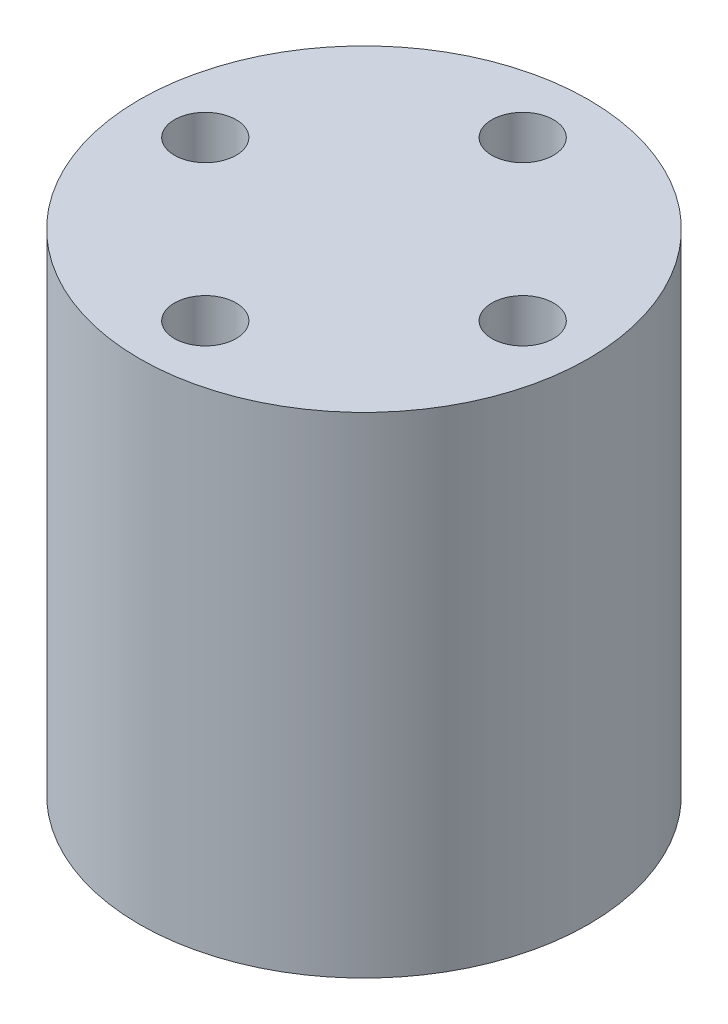
ISO-10303-21;
HEADER;
FILE_DESCRIPTION(('STEP AP214'),'2;1');
FILE_NAME('part.step','',(''),(''),'','','');
FILE_SCHEMA(('AUTOMOTIVE_DESIGN { 1 0 10303 214 1 1 1 1 }'));
ENDSEC;
DATA;
#1=APPLICATION_CONTEXT('core data for automotive mechanical design processes');
#2=APPLICATION_PROTOCOL_DEFINITION('international standard','automotive_design',2000,#1);
#3=PRODUCT_CONTEXT('',#1,'mechanical');
#4=PRODUCT('Part','Part','',(#3));
#5=PRODUCT_RELATED_PRODUCT_CATEGORY('part','',(#4));
#6=PRODUCT_DEFINITION_FORMATION('','',#4);
#7=PRODUCT_DEFINITION_CONTEXT('part definition',#1,'design');
#8=PRODUCT_DEFINITION('design','',#6,#7);
#9=PRODUCT_DEFINITION_SHAPE('','',#8);
#10=(LENGTH_UNIT() NAMED_UNIT(*) SI_UNIT(.MILLI.,.METRE.));
#11=(NAMED_UNIT(*) PLANE_ANGLE_UNIT() SI_UNIT($,.RADIAN.));
#12=(NAMED_UNIT(*) SI_UNIT($,.STERADIAN.) SOLID_ANGLE_UNIT());
#13=UNCERTAINTY_MEASURE_WITH_UNIT(LENGTH_MEASURE(1.E-05),#10,'distance_accuracy_value','');
#14=(GEOMETRIC_REPRESENTATION_CONTEXT(3) GLOBAL_UNCERTAINTY_ASSIGNED_CONTEXT((#13)) GLOBAL_UNIT_ASSIGNED_CONTEXT((#10,
#11,#12)) REPRESENTATION_CONTEXT('',''));
#15=CARTESIAN_POINT('',(0.,0.,0.));
#16=DIRECTION('',(0.,0.,1.));
#17=DIRECTION('',(1.,0.,0.));
#18=AXIS2_PLACEMENT_3D('',#15,#16,#17);
#19=CARTESIAN_POINT('',(-11.3137084989848,34.925,0.));
#20=DIRECTION('',(0.,-1.,0.));
#21=DIRECTION('',(0.,0.,-1.));
#22=AXIS2_PLACEMENT_3D('',#19,#20,#21);
#23=CYLINDRICAL_SURFACE('',#22,2.2);
#24=CARTESIAN_POINT('',(-11.3137084989848,34.925,0.));
#25=DIRECTION('',(0.,1.,0.));
#26=DIRECTION('',(0.,0.,1.));
#27=AXIS2_PLACEMENT_3D('',#24,#25,#26);
#28=CIRCLE('',#27,2.2);
#29=CARTESIAN_POINT('',(-11.3137084989848,34.925,2.2));
#30=VERTEX_POINT('',#29);
#31=EDGE_CURVE('E41',#30,#30,#28,.T.);
#32=ORIENTED_EDGE('',*,*,#31,.T.);
#33=EDGE_LOOP('',(#32));
#34=FACE_BOUND('',#33,.T.);
#35=CARTESIAN_POINT('',(-11.3137084989848,0.,0.));
#36=DIRECTION('',(0.,1.,0.));
#37=DIRECTION('',(0.,0.,1.));
#38=AXIS2_PLACEMENT_3D('',#35,#36,#37);
#39=CIRCLE('',#38,2.2);
#40=CARTESIAN_POINT('',(-11.3137084989848,0.,2.2));
#41=VERTEX_POINT('',#40);
#42=EDGE_CURVE('E58',#41,#41,#39,.T.);
#43=ORIENTED_EDGE('',*,*,#42,.F.);
#44=EDGE_LOOP('',(#43));
#45=FACE_BOUND('',#44,.T.);
#46=ADVANCED_FACE('F33',(#34,#45),#23,.F.);
#47=CARTESIAN_POINT('',(0.,34.925,-11.3137084989848));
#48=DIRECTION('',(0.,-1.,0.));
#49=DIRECTION('',(0.,0.,-1.));
#50=AXIS2_PLACEMENT_3D('',#47,#48,#49);
#51=CYLINDRICAL_SURFACE('',#50,2.2);
#52=CARTESIAN_POINT('',(0.,34.925,-11.3137084989848));
#53=DIRECTION('',(0.,1.,0.));
#54=DIRECTION('',(0.,0.,1.));
#55=AXIS2_PLACEMENT_3D('',#52,#53,#54);
#56=CIRCLE('',#55,2.2);
#57=CARTESIAN_POINT('',(0.,34.925,-9.11370849898476));
#58=VERTEX_POINT('',#57);
#59=EDGE_CURVE('E46',#58,#58,#56,.T.);
#60=ORIENTED_EDGE('',*,*,#59,.T.);
#61=EDGE_LOOP('',(#60));
#62=FACE_BOUND('',#61,.T.);
#63=CARTESIAN_POINT('',(0.,0.,-11.3137084989848));
#64=DIRECTION('',(0.,1.,0.));
#65=DIRECTION('',(0.,0.,1.));
#66=AXIS2_PLACEMENT_3D('',#63,#64,#65);
#67=CIRCLE('',#66,2.2);
#68=CARTESIAN_POINT('',(0.,0.,-9.11370849898476));
#69=VERTEX_POINT('',#68);
#70=EDGE_CURVE('E56',#69,#69,#67,.T.);
#71=ORIENTED_EDGE('',*,*,#70,.F.);
#72=EDGE_LOOP('',(#71));
#73=FACE_BOUND('',#72,.T.);
#74=ADVANCED_FACE('F76',(#62,#73),#51,.F.);
#75=CARTESIAN_POINT('',(11.3137084989848,34.925,0.));
#76=DIRECTION('',(0.,-1.,0.));
#77=DIRECTION('',(0.,0.,-1.));
#78=AXIS2_PLACEMENT_3D('',#75,#76,#77);
#79=CYLINDRICAL_SURFACE('',#78,2.2);
#80=CARTESIAN_POINT('',(11.3137084989848,34.925,0.));
#81=DIRECTION('',(0.,1.,0.));
#82=DIRECTION('',(0.,0.,1.));
#83=AXIS2_PLACEMENT_3D('',#80,#81,#82);
#84=CIRCLE('',#83,2.2);
#85=CARTESIAN_POINT('',(11.3137084989848,34.925,2.2));
#86=VERTEX_POINT('',#85);
#87=EDGE_CURVE('E67',#86,#86,#84,.T.);
#88=ORIENTED_EDGE('',*,*,#87,.T.);
#89=EDGE_LOOP('',(#88));
#90=FACE_BOUND('',#89,.T.);
#91=CARTESIAN_POINT('',(11.3137084989848,0.,0.));
#92=DIRECTION('',(0.,1.,0.));
#93=DIRECTION('',(0.,0.,1.));
#94=AXIS2_PLACEMENT_3D('',#91,#92,#93);
#95=CIRCLE('',#94,2.2);
#96=CARTESIAN_POINT('',(11.3137084989848,0.,2.2));
#97=VERTEX_POINT('',#96);
#98=EDGE_CURVE('E53',#97,#97,#95,.T.);
#99=ORIENTED_EDGE('',*,*,#98,.F.);
#100=EDGE_LOOP('',(#99));
#101=FACE_BOUND('',#100,.T.);
#102=ADVANCED_FACE('F94',(#90,#101),#79,.F.);
#103=CARTESIAN_POINT('',(0.,34.925,11.3137084989848));
#104=DIRECTION('',(0.,-1.,0.));
#105=DIRECTION('',(0.,0.,-1.));
#106=AXIS2_PLACEMENT_3D('',#103,#104,#105);
#107=CYLINDRICAL_SURFACE('',#106,2.2);
#108=CARTESIAN_POINT('',(0.,34.925,11.3137084989848));
#109=DIRECTION('',(0.,1.,0.));
#110=DIRECTION('',(0.,0.,1.));
#111=AXIS2_PLACEMENT_3D('',#108,#109,#110);
#112=CIRCLE('',#111,2.2);
#113=CARTESIAN_POINT('',(0.,34.925,13.5137084989848));
#114=VERTEX_POINT('',#113);
#115=EDGE_CURVE('E63',#114,#114,#112,.T.);
#116=ORIENTED_EDGE('',*,*,#115,.T.);
#117=EDGE_LOOP('',(#116));
#118=FACE_BOUND('',#117,.T.);
#119=CARTESIAN_POINT('',(0.,0.,11.3137084989848));
#120=DIRECTION('',(0.,1.,0.));
#121=DIRECTION('',(0.,0.,1.));
#122=AXIS2_PLACEMENT_3D('',#119,#120,#121);
#123=CIRCLE('',#122,2.2);
#124=CARTESIAN_POINT('',(0.,0.,13.5137084989848));
#125=VERTEX_POINT('',#124);
#126=EDGE_CURVE('E50',#125,#125,#123,.T.);
#127=ORIENTED_EDGE('',*,*,#126,.F.);
#128=EDGE_LOOP('',(#127));
#129=FACE_BOUND('',#128,.T.);
#130=ADVANCED_FACE('F35',(#118,#129),#107,.F.);
#131=CARTESIAN_POINT('',(0.,34.925,0.));
#132=DIRECTION('',(0.,-1.,0.));
#133=DIRECTION('',(0.,0.,-1.));
#134=AXIS2_PLACEMENT_3D('',#131,#132,#133);
#135=CYLINDRICAL_SURFACE('',#134,16.);
#136=CARTESIAN_POINT('',(0.,34.925,0.));
#137=DIRECTION('',(0.,1.,0.));
#138=DIRECTION('',(0.,0.,1.));
#139=AXIS2_PLACEMENT_3D('',#136,#137,#138);
#140=CIRCLE('',#139,16.);
#141=CARTESIAN_POINT('',(0.,34.925,16.));
#142=VERTEX_POINT('',#141);
#143=EDGE_CURVE('E10',#142,#142,#140,.T.);
#144=ORIENTED_EDGE('',*,*,#143,.F.);
#145=EDGE_LOOP('',(#144));
#146=FACE_BOUND('',#145,.T.);
#147=CARTESIAN_POINT('',(0.,0.,0.));
#148=DIRECTION('',(0.,1.,0.));
#149=DIRECTION('',(0.,0.,1.));
#150=AXIS2_PLACEMENT_3D('',#147,#148,#149);
#151=CIRCLE('',#150,16.);
#152=CARTESIAN_POINT('',(0.,0.,16.));
#153=VERTEX_POINT('',#152);
#154=EDGE_CURVE('E37',#153,#153,#151,.T.);
#155=ORIENTED_EDGE('',*,*,#154,.T.);
#156=EDGE_LOOP('',(#155));
#157=FACE_BOUND('',#156,.T.);
#158=ADVANCED_FACE('F83',(#146,#157),#135,.T.);
#159=CARTESIAN_POINT('',(0.,34.925,0.));
#160=DIRECTION('',(0.,1.,0.));
#161=DIRECTION('',(0.,0.,1.));
#162=AXIS2_PLACEMENT_3D('',#159,#160,#161);
#163=PLANE('',#162);
#164=ORIENTED_EDGE('',*,*,#115,.F.);
#165=EDGE_LOOP('',(#164));
#166=FACE_BOUND('',#165,.T.);
#167=ORIENTED_EDGE('',*,*,#87,.F.);
#168=EDGE_LOOP('',(#167));
#169=FACE_BOUND('',#168,.T.);
#170=ORIENTED_EDGE('',*,*,#59,.F.);
#171=EDGE_LOOP('',(#170));
#172=FACE_BOUND('',#171,.T.);
#173=ORIENTED_EDGE('',*,*,#31,.F.);
#174=EDGE_LOOP('',(#173));
#175=FACE_BOUND('',#174,.T.);
#176=ORIENTED_EDGE('',*,*,#143,.T.);
#177=EDGE_LOOP('',(#176));
#178=FACE_BOUND('',#177,.T.);
#179=ADVANCED_FACE('F79',(#166,#169,#172,#175,#178),#163,.T.);
#180=CARTESIAN_POINT('',(0.,0.,0.));
#181=DIRECTION('',(0.,1.,0.));
#182=DIRECTION('',(0.,0.,1.));
#183=AXIS2_PLACEMENT_3D('',#180,#181,#182);
#184=PLANE('',#183);
#185=ORIENTED_EDGE('',*,*,#126,.T.);
#186=EDGE_LOOP('',(#185));
#187=FACE_BOUND('',#186,.T.);
#188=ORIENTED_EDGE('',*,*,#98,.T.);
#189=EDGE_LOOP('',(#188));
#190=FACE_BOUND('',#189,.T.);
#191=ORIENTED_EDGE('',*,*,#70,.T.);
#192=EDGE_LOOP('',(#191));
#193=FACE_BOUND('',#192,.T.);
#194=ORIENTED_EDGE('',*,*,#42,.T.);
#195=EDGE_LOOP('',(#194));
#196=FACE_BOUND('',#195,.T.);
#197=ORIENTED_EDGE('',*,*,#154,.F.);
#198=EDGE_LOOP('',(#197));
#199=FACE_BOUND('',#198,.T.);
#200=ADVANCED_FACE('F82',(#187,#190,#193,#196,#199),#184,.F.);
#201=CLOSED_SHELL('',(#46,#74,#102,#130,#158,#179,#200));
#202=MANIFOLD_SOLID_BREP('B2',#201);
#203=ADVANCED_BREP_SHAPE_REPRESENTATION('',(#18,#202),#14);
#204=SHAPE_DEFINITION_REPRESENTATION(#9,#203);
ENDSEC;
END-ISO-10303-21;
